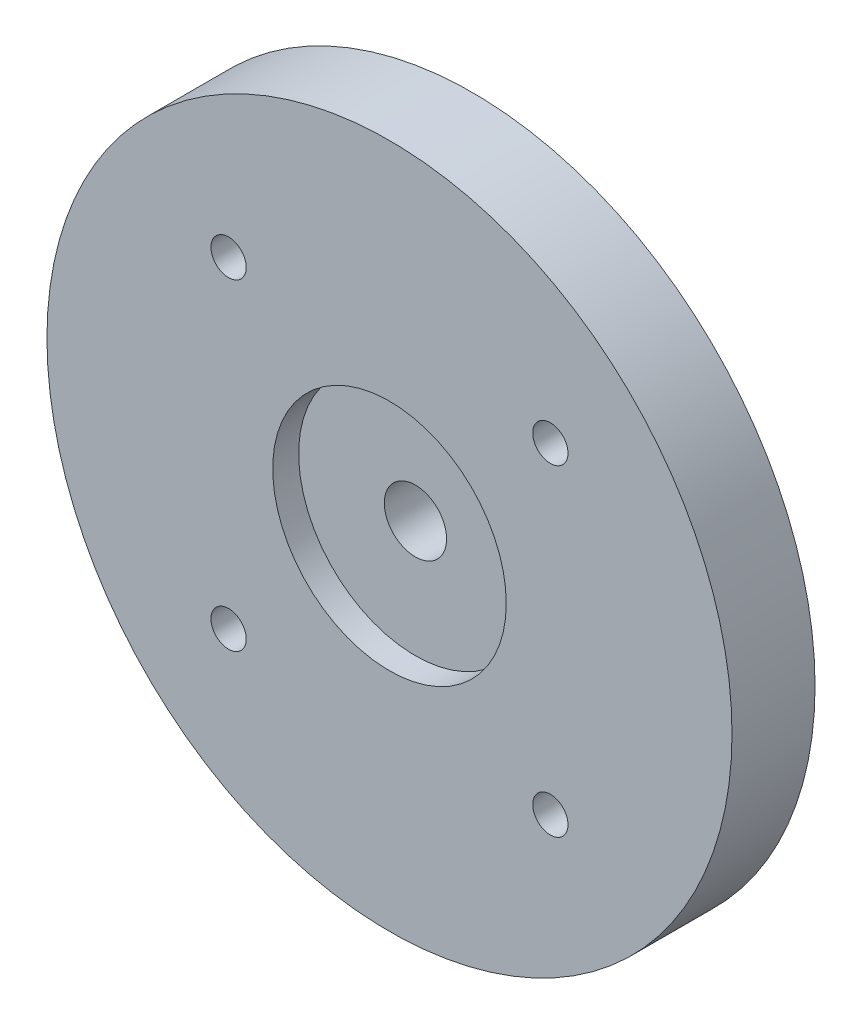
ISO-10303-21;
HEADER;
FILE_DESCRIPTION(('STEP AP214'),'2;1');
FILE_NAME('part.step','',(''),(''),'','','');
FILE_SCHEMA(('AUTOMOTIVE_DESIGN { 1 0 10303 214 1 1 1 1 }'));
ENDSEC;
DATA;
#1=APPLICATION_CONTEXT('core data for automotive mechanical design processes');
#2=APPLICATION_PROTOCOL_DEFINITION('international standard','automotive_design',2000,#1);
#3=PRODUCT_CONTEXT('',#1,'mechanical');
#4=PRODUCT('Part','Part','',(#3));
#5=PRODUCT_RELATED_PRODUCT_CATEGORY('part','',(#4));
#6=PRODUCT_DEFINITION_FORMATION('','',#4);
#7=PRODUCT_DEFINITION_CONTEXT('part definition',#1,'design');
#8=PRODUCT_DEFINITION('design','',#6,#7);
#9=PRODUCT_DEFINITION_SHAPE('','',#8);
#10=(LENGTH_UNIT() NAMED_UNIT(*) SI_UNIT(.MILLI.,.METRE.));
#11=(NAMED_UNIT(*) PLANE_ANGLE_UNIT() SI_UNIT($,.RADIAN.));
#12=(NAMED_UNIT(*) SI_UNIT($,.STERADIAN.) SOLID_ANGLE_UNIT());
#13=UNCERTAINTY_MEASURE_WITH_UNIT(LENGTH_MEASURE(1.E-05),#10,'distance_accuracy_value','');
#14=(GEOMETRIC_REPRESENTATION_CONTEXT(3) GLOBAL_UNCERTAINTY_ASSIGNED_CONTEXT((#13)) GLOBAL_UNIT_ASSIGNED_CONTEXT((#10,
#11,#12)) REPRESENTATION_CONTEXT('',''));
#15=CARTESIAN_POINT('',(0.,0.,0.));
#16=DIRECTION('',(0.,0.,1.));
#17=DIRECTION('',(1.,0.,0.));
#18=AXIS2_PLACEMENT_3D('',#15,#16,#17);
#19=CARTESIAN_POINT('',(0.,0.,-2.));
#20=DIRECTION('',(0.,0.,1.));
#21=DIRECTION('',(1.,0.,0.));
#22=AXIS2_PLACEMENT_3D('',#19,#20,#21);
#23=CYLINDRICAL_SURFACE('',#22,3.);
#24=CARTESIAN_POINT('',(0.,0.,-2.));
#25=DIRECTION('',(0.,0.,1.));
#26=DIRECTION('',(1.,0.,0.));
#27=AXIS2_PLACEMENT_3D('',#24,#25,#26);
#28=CIRCLE('',#27,3.);
#29=CARTESIAN_POINT('',(3.,0.,-2.));
#30=VERTEX_POINT('',#29);
#31=EDGE_CURVE('E64',#30,#30,#28,.T.);
#32=ORIENTED_EDGE('',*,*,#31,.F.);
#33=EDGE_LOOP('',(#32));
#34=FACE_BOUND('',#33,.T.);
#35=CARTESIAN_POINT('',(0.,0.,5.5));
#36=DIRECTION('',(0.,0.,1.));
#37=DIRECTION('',(1.,0.,0.));
#38=AXIS2_PLACEMENT_3D('',#35,#36,#37);
#39=CIRCLE('',#38,3.);
#40=CARTESIAN_POINT('',(3.,0.,5.5));
#41=VERTEX_POINT('',#40);
#42=EDGE_CURVE('E47',#41,#41,#39,.F.);
#43=ORIENTED_EDGE('',*,*,#42,.F.);
#44=EDGE_LOOP('',(#43));
#45=FACE_BOUND('',#44,.T.);
#46=ADVANCED_FACE('F43',(#34,#45),#23,.F.);
#47=CARTESIAN_POINT('',(-15.5,15.5,-2.));
#48=DIRECTION('',(0.,0.,1.));
#49=DIRECTION('',(1.,0.,0.));
#50=AXIS2_PLACEMENT_3D('',#47,#48,#49);
#51=CYLINDRICAL_SURFACE('',#50,1.7);
#52=CARTESIAN_POINT('',(-15.5,15.5,8.));
#53=DIRECTION('',(0.,0.,1.));
#54=DIRECTION('',(1.,0.,0.));
#55=AXIS2_PLACEMENT_3D('',#52,#53,#54);
#56=CIRCLE('',#55,1.7);
#57=CARTESIAN_POINT('',(-13.8,15.5,8.));
#58=VERTEX_POINT('',#57);
#59=EDGE_CURVE('E117',#58,#58,#56,.T.);
#60=ORIENTED_EDGE('',*,*,#59,.T.);
#61=EDGE_LOOP('',(#60));
#62=FACE_BOUND('',#61,.T.);
#63=CARTESIAN_POINT('',(-15.5,15.5,2.));
#64=DIRECTION('',(0.,0.,-1.));
#65=DIRECTION('',(-1.,0.,0.));
#66=AXIS2_PLACEMENT_3D('',#63,#64,#65);
#67=CIRCLE('',#66,1.7);
#68=CARTESIAN_POINT('',(-17.2,15.5,2.));
#69=VERTEX_POINT('',#68);
#70=EDGE_CURVE('E77',#69,#69,#67,.F.);
#71=ORIENTED_EDGE('',*,*,#70,.F.);
#72=EDGE_LOOP('',(#71));
#73=FACE_BOUND('',#72,.T.);
#74=ADVANCED_FACE('F187',(#62,#73),#51,.F.);
#75=CARTESIAN_POINT('',(15.5,15.5,-2.));
#76=DIRECTION('',(0.,0.,1.));
#77=DIRECTION('',(1.,0.,0.));
#78=AXIS2_PLACEMENT_3D('',#75,#76,#77);
#79=CYLINDRICAL_SURFACE('',#78,1.7);
#80=CARTESIAN_POINT('',(15.5,15.5,8.));
#81=DIRECTION('',(0.,0.,1.));
#82=DIRECTION('',(1.,0.,0.));
#83=AXIS2_PLACEMENT_3D('',#80,#81,#82);
#84=CIRCLE('',#83,1.7);
#85=CARTESIAN_POINT('',(17.2,15.5,8.));
#86=VERTEX_POINT('',#85);
#87=EDGE_CURVE('E113',#86,#86,#84,.T.);
#88=ORIENTED_EDGE('',*,*,#87,.T.);
#89=EDGE_LOOP('',(#88));
#90=FACE_BOUND('',#89,.T.);
#91=CARTESIAN_POINT('',(15.5,15.5,2.));
#92=DIRECTION('',(0.,0.,-1.));
#93=DIRECTION('',(-1.,0.,0.));
#94=AXIS2_PLACEMENT_3D('',#91,#92,#93);
#95=CIRCLE('',#94,1.7);
#96=CARTESIAN_POINT('',(13.8,15.5,2.));
#97=VERTEX_POINT('',#96);
#98=EDGE_CURVE('E81',#97,#97,#95,.F.);
#99=ORIENTED_EDGE('',*,*,#98,.F.);
#100=EDGE_LOOP('',(#99));
#101=FACE_BOUND('',#100,.T.);
#102=ADVANCED_FACE('F195',(#90,#101),#79,.F.);
#103=CARTESIAN_POINT('',(15.5,-15.5,-2.));
#104=DIRECTION('',(0.,0.,1.));
#105=DIRECTION('',(1.,0.,0.));
#106=AXIS2_PLACEMENT_3D('',#103,#104,#105);
#107=CYLINDRICAL_SURFACE('',#106,1.7);
#108=CARTESIAN_POINT('',(15.5,-15.5,8.));
#109=DIRECTION('',(0.,0.,1.));
#110=DIRECTION('',(1.,0.,0.));
#111=AXIS2_PLACEMENT_3D('',#108,#109,#110);
#112=CIRCLE('',#111,1.7);
#113=CARTESIAN_POINT('',(17.2,-15.5,8.));
#114=VERTEX_POINT('',#113);
#115=EDGE_CURVE('E109',#114,#114,#112,.T.);
#116=ORIENTED_EDGE('',*,*,#115,.T.);
#117=EDGE_LOOP('',(#116));
#118=FACE_BOUND('',#117,.T.);
#119=CARTESIAN_POINT('',(15.5,-15.5,2.));
#120=DIRECTION('',(0.,0.,-1.));
#121=DIRECTION('',(-1.,0.,0.));
#122=AXIS2_PLACEMENT_3D('',#119,#120,#121);
#123=CIRCLE('',#122,1.7);
#124=CARTESIAN_POINT('',(13.8,-15.5,2.));
#125=VERTEX_POINT('',#124);
#126=EDGE_CURVE('E85',#125,#125,#123,.F.);
#127=ORIENTED_EDGE('',*,*,#126,.F.);
#128=EDGE_LOOP('',(#127));
#129=FACE_BOUND('',#128,.T.);
#130=ADVANCED_FACE('F223',(#118,#129),#107,.F.);
#131=CARTESIAN_POINT('',(-15.5,-15.5,-2.));
#132=DIRECTION('',(0.,0.,1.));
#133=DIRECTION('',(1.,0.,0.));
#134=AXIS2_PLACEMENT_3D('',#131,#132,#133);
#135=CYLINDRICAL_SURFACE('',#134,1.7);
#136=CARTESIAN_POINT('',(-15.5,-15.5,8.));
#137=DIRECTION('',(0.,0.,1.));
#138=DIRECTION('',(1.,0.,0.));
#139=AXIS2_PLACEMENT_3D('',#136,#137,#138);
#140=CIRCLE('',#139,1.7);
#141=CARTESIAN_POINT('',(-13.8,-15.5,8.));
#142=VERTEX_POINT('',#141);
#143=EDGE_CURVE('E105',#142,#142,#140,.T.);
#144=ORIENTED_EDGE('',*,*,#143,.T.);
#145=EDGE_LOOP('',(#144));
#146=FACE_BOUND('',#145,.T.);
#147=CARTESIAN_POINT('',(-15.5,-15.5,2.));
#148=DIRECTION('',(0.,0.,-1.));
#149=DIRECTION('',(-1.,0.,0.));
#150=AXIS2_PLACEMENT_3D('',#147,#148,#149);
#151=CIRCLE('',#150,1.7);
#152=CARTESIAN_POINT('',(-17.2,-15.5,2.));
#153=VERTEX_POINT('',#152);
#154=EDGE_CURVE('E89',#153,#153,#151,.F.);
#155=ORIENTED_EDGE('',*,*,#154,.F.);
#156=EDGE_LOOP('',(#155));
#157=FACE_BOUND('',#156,.T.);
#158=ADVANCED_FACE('F200',(#146,#157),#135,.F.);
#159=CARTESIAN_POINT('',(0.,0.,8.));
#160=DIRECTION('',(0.,0.,-1.));
#161=DIRECTION('',(-1.,0.,0.));
#162=AXIS2_PLACEMENT_3D('',#159,#160,#161);
#163=CYLINDRICAL_SURFACE('',#162,33.);
#164=CARTESIAN_POINT('',(0.,0.,8.));
#165=DIRECTION('',(0.,0.,1.));
#166=DIRECTION('',(1.,0.,0.));
#167=AXIS2_PLACEMENT_3D('',#164,#165,#166);
#168=CIRCLE('',#167,33.);
#169=CARTESIAN_POINT('',(33.,0.,8.));
#170=VERTEX_POINT('',#169);
#171=EDGE_CURVE('E57',#170,#170,#168,.T.);
#172=ORIENTED_EDGE('',*,*,#171,.F.);
#173=EDGE_LOOP('',(#172));
#174=FACE_BOUND('',#173,.T.);
#175=CARTESIAN_POINT('',(0.,0.,0.));
#176=DIRECTION('',(0.,0.,1.));
#177=DIRECTION('',(1.,0.,0.));
#178=AXIS2_PLACEMENT_3D('',#175,#176,#177);
#179=CIRCLE('',#178,33.);
#180=CARTESIAN_POINT('',(33.,0.,0.));
#181=VERTEX_POINT('',#180);
#182=EDGE_CURVE('E94',#181,#181,#179,.T.);
#183=ORIENTED_EDGE('',*,*,#182,.T.);
#184=EDGE_LOOP('',(#183));
#185=FACE_BOUND('',#184,.T.);
#186=ADVANCED_FACE('F215',(#174,#185),#163,.T.);
#187=CARTESIAN_POINT('',(0.,0.,8.));
#188=DIRECTION('',(0.,0.,1.));
#189=DIRECTION('',(1.,0.,0.));
#190=AXIS2_PLACEMENT_3D('',#187,#188,#189);
#191=PLANE('',#190);
#192=CARTESIAN_POINT('',(0.,0.,8.));
#193=DIRECTION('',(0.,0.,1.));
#194=DIRECTION('',(1.,0.,0.));
#195=AXIS2_PLACEMENT_3D('',#192,#193,#194);
#196=CIRCLE('',#195,11.25);
#197=CARTESIAN_POINT('',(11.25,0.,8.));
#198=VERTEX_POINT('',#197);
#199=EDGE_CURVE('E171',#198,#198,#196,.T.);
#200=ORIENTED_EDGE('',*,*,#199,.F.);
#201=EDGE_LOOP('',(#200));
#202=FACE_BOUND('',#201,.T.);
#203=ORIENTED_EDGE('',*,*,#143,.F.);
#204=EDGE_LOOP('',(#203));
#205=FACE_BOUND('',#204,.T.);
#206=ORIENTED_EDGE('',*,*,#115,.F.);
#207=EDGE_LOOP('',(#206));
#208=FACE_BOUND('',#207,.T.);
#209=ORIENTED_EDGE('',*,*,#87,.F.);
#210=EDGE_LOOP('',(#209));
#211=FACE_BOUND('',#210,.T.);
#212=ORIENTED_EDGE('',*,*,#59,.F.);
#213=EDGE_LOOP('',(#212));
#214=FACE_BOUND('',#213,.T.);
#215=ORIENTED_EDGE('',*,*,#171,.T.);
#216=EDGE_LOOP('',(#215));
#217=FACE_BOUND('',#216,.T.);
#218=ADVANCED_FACE('F213',(#202,#205,#208,#211,#214,#217),#191,.T.);
#219=CARTESIAN_POINT('',(0.,0.,0.));
#220=DIRECTION('',(0.,0.,1.));
#221=DIRECTION('',(1.,0.,0.));
#222=AXIS2_PLACEMENT_3D('',#219,#220,#221);
#223=PLANE('',#222);
#224=CARTESIAN_POINT('',(0.,0.,0.));
#225=DIRECTION('',(0.,0.,1.));
#226=DIRECTION('',(1.,0.,0.));
#227=AXIS2_PLACEMENT_3D('',#224,#225,#226);
#228=CIRCLE('',#227,11.);
#229=CARTESIAN_POINT('',(11.,0.,0.));
#230=VERTEX_POINT('',#229);
#231=EDGE_CURVE('E10',#230,#230,#228,.T.);
#232=ORIENTED_EDGE('',*,*,#231,.T.);
#233=EDGE_LOOP('',(#232));
#234=FACE_BOUND('',#233,.T.);
#235=CARTESIAN_POINT('',(0.,29.5,0.));
#236=DIRECTION('',(0.,0.,-1.));
#237=DIRECTION('',(-1.,0.,0.));
#238=AXIS2_PLACEMENT_3D('',#235,#236,#237);
#239=CIRCLE('',#238,2.1);
#240=CARTESIAN_POINT('',(-2.1,29.5,0.));
#241=VERTEX_POINT('',#240);
#242=EDGE_CURVE('E164',#241,#241,#239,.T.);
#243=ORIENTED_EDGE('',*,*,#242,.F.);
#244=EDGE_LOOP('',(#243));
#245=FACE_BOUND('',#244,.T.);
#246=CARTESIAN_POINT('',(-29.5,-5.65519853168439E-13,0.));
#247=DIRECTION('',(0.,0.,-1.));
#248=DIRECTION('',(-1.,0.,0.));
#249=AXIS2_PLACEMENT_3D('',#246,#247,#248);
#250=CIRCLE('',#249,2.1);
#251=CARTESIAN_POINT('',(-31.6,-5.65519853168439E-13,0.));
#252=VERTEX_POINT('',#251);
#253=EDGE_CURVE('E160',#252,#252,#250,.T.);
#254=ORIENTED_EDGE('',*,*,#253,.F.);
#255=EDGE_LOOP('',(#254));
#256=FACE_BOUND('',#255,.T.);
#257=CARTESIAN_POINT('',(6.96595987118696E-13,-29.5,0.));
#258=DIRECTION('',(0.,0.,-1.));
#259=DIRECTION('',(-1.,0.,0.));
#260=AXIS2_PLACEMENT_3D('',#257,#258,#259);
#261=CIRCLE('',#260,2.1);
#262=CARTESIAN_POINT('',(-2.0999999999993,-29.5,0.));
#263=VERTEX_POINT('',#262);
#264=EDGE_CURVE('E152',#263,#263,#261,.T.);
#265=ORIENTED_EDGE('',*,*,#264,.F.);
#266=EDGE_LOOP('',(#265));
#267=FACE_BOUND('',#266,.T.);
#268=CARTESIAN_POINT('',(29.5000000000006,0.,0.));
#269=DIRECTION('',(0.,0.,-1.));
#270=DIRECTION('',(-1.,0.,0.));
#271=AXIS2_PLACEMENT_3D('',#268,#269,#270);
#272=CIRCLE('',#271,2.10000000000062);
#273=CARTESIAN_POINT('',(27.3999999999999,0.,0.));
#274=VERTEX_POINT('',#273);
#275=EDGE_CURVE('E144',#274,#274,#272,.T.);
#276=ORIENTED_EDGE('',*,*,#275,.F.);
#277=EDGE_LOOP('',(#276));
#278=FACE_BOUND('',#277,.T.);
#279=CARTESIAN_POINT('',(15.5,-15.5,0.));
#280=DIRECTION('',(0.,0.,1.));
#281=DIRECTION('',(1.,0.,0.));
#282=AXIS2_PLACEMENT_3D('',#279,#280,#281);
#283=CIRCLE('',#282,2.8);
#284=CARTESIAN_POINT('',(18.3,-15.5,0.));
#285=VERTEX_POINT('',#284);
#286=EDGE_CURVE('E60',#285,#285,#283,.F.);
#287=ORIENTED_EDGE('',*,*,#286,.F.);
#288=EDGE_LOOP('',(#287));
#289=FACE_BOUND('',#288,.T.);
#290=CARTESIAN_POINT('',(-15.5,-15.5,0.));
#291=DIRECTION('',(0.,0.,1.));
#292=DIRECTION('',(1.,0.,0.));
#293=AXIS2_PLACEMENT_3D('',#290,#291,#292);
#294=CIRCLE('',#293,2.8);
#295=CARTESIAN_POINT('',(-12.7,-15.5,0.));
#296=VERTEX_POINT('',#295);
#297=EDGE_CURVE('E65',#296,#296,#294,.F.);
#298=ORIENTED_EDGE('',*,*,#297,.F.);
#299=EDGE_LOOP('',(#298));
#300=FACE_BOUND('',#299,.T.);
#301=CARTESIAN_POINT('',(-15.5,15.5,0.));
#302=DIRECTION('',(0.,0.,1.));
#303=DIRECTION('',(1.,0.,0.));
#304=AXIS2_PLACEMENT_3D('',#301,#302,#303);
#305=CIRCLE('',#304,2.8);
#306=CARTESIAN_POINT('',(-12.7,15.5,0.));
#307=VERTEX_POINT('',#306);
#308=EDGE_CURVE('E69',#307,#307,#305,.F.);
#309=ORIENTED_EDGE('',*,*,#308,.F.);
#310=EDGE_LOOP('',(#309));
#311=FACE_BOUND('',#310,.T.);
#312=CARTESIAN_POINT('',(15.5,15.5,0.));
#313=DIRECTION('',(0.,0.,1.));
#314=DIRECTION('',(1.,0.,0.));
#315=AXIS2_PLACEMENT_3D('',#312,#313,#314);
#316=CIRCLE('',#315,2.8);
#317=CARTESIAN_POINT('',(18.3,15.5,0.));
#318=VERTEX_POINT('',#317);
#319=EDGE_CURVE('E73',#318,#318,#316,.F.);
#320=ORIENTED_EDGE('',*,*,#319,.F.);
#321=EDGE_LOOP('',(#320));
#322=FACE_BOUND('',#321,.T.);
#323=ORIENTED_EDGE('',*,*,#182,.F.);
#324=EDGE_LOOP('',(#323));
#325=FACE_BOUND('',#324,.T.);
#326=ADVANCED_FACE('F211',(#234,#245,#256,#267,#278,#289,#300,#311,#322,#325),#223,.F.);
#327=CARTESIAN_POINT('',(0.,0.,-2.));
#328=DIRECTION('',(0.,0.,1.));
#329=DIRECTION('',(1.,0.,0.));
#330=AXIS2_PLACEMENT_3D('',#327,#328,#329);
#331=CYLINDRICAL_SURFACE('',#330,10.);
#332=CARTESIAN_POINT('',(0.,0.,-1.));
#333=DIRECTION('',(0.,0.,1.));
#334=DIRECTION('',(1.,0.,0.));
#335=AXIS2_PLACEMENT_3D('',#332,#333,#334);
#336=CIRCLE('',#335,10.);
#337=CARTESIAN_POINT('',(10.,0.,-1.));
#338=VERTEX_POINT('',#337);
#339=EDGE_CURVE('E52',#338,#338,#336,.F.);
#340=ORIENTED_EDGE('',*,*,#339,.T.);
#341=EDGE_LOOP('',(#340));
#342=FACE_BOUND('',#341,.T.);
#343=CARTESIAN_POINT('',(0.,0.,-2.));
#344=DIRECTION('',(0.,0.,-1.));
#345=DIRECTION('',(-1.,0.,0.));
#346=AXIS2_PLACEMENT_3D('',#343,#344,#345);
#347=CIRCLE('',#346,10.);
#348=CARTESIAN_POINT('',(-10.,0.,-2.));
#349=VERTEX_POINT('',#348);
#350=EDGE_CURVE('E98',#349,#349,#347,.T.);
#351=ORIENTED_EDGE('',*,*,#350,.F.);
#352=EDGE_LOOP('',(#351));
#353=FACE_BOUND('',#352,.T.);
#354=ADVANCED_FACE('F207',(#342,#353),#331,.T.);
#355=CARTESIAN_POINT('',(0.,0.,-2.));
#356=DIRECTION('',(0.,0.,-1.));
#357=DIRECTION('',(-1.,0.,0.));
#358=AXIS2_PLACEMENT_3D('',#355,#356,#357);
#359=PLANE('',#358);
#360=ORIENTED_EDGE('',*,*,#31,.T.);
#361=EDGE_LOOP('',(#360));
#362=FACE_BOUND('',#361,.T.);
#363=ORIENTED_EDGE('',*,*,#350,.T.);
#364=EDGE_LOOP('',(#363));
#365=FACE_BOUND('',#364,.T.);
#366=ADVANCED_FACE('F203',(#362,#365),#359,.T.);
#367=CARTESIAN_POINT('',(-15.5,-15.5,-2.));
#368=DIRECTION('',(0.,0.,1.));
#369=DIRECTION('',(1.,0.,0.));
#370=AXIS2_PLACEMENT_3D('',#367,#368,#369);
#371=CYLINDRICAL_SURFACE('',#370,2.8);
#372=CARTESIAN_POINT('',(-15.5,-15.5,2.));
#373=DIRECTION('',(0.,0.,-1.));
#374=DIRECTION('',(-1.,0.,0.));
#375=AXIS2_PLACEMENT_3D('',#372,#373,#374);
#376=CIRCLE('',#375,2.8);
#377=CARTESIAN_POINT('',(-18.3,-15.5,2.));
#378=VERTEX_POINT('',#377);
#379=EDGE_CURVE('E132',#378,#378,#376,.T.);
#380=ORIENTED_EDGE('',*,*,#379,.F.);
#381=EDGE_LOOP('',(#380));
#382=FACE_BOUND('',#381,.T.);
#383=ORIENTED_EDGE('',*,*,#297,.T.);
#384=EDGE_LOOP('',(#383));
#385=FACE_BOUND('',#384,.T.);
#386=ADVANCED_FACE('F206',(#382,#385),#371,.F.);
#387=CARTESIAN_POINT('',(-15.5,-15.5,2.));
#388=DIRECTION('',(0.,0.,-1.));
#389=DIRECTION('',(-1.,0.,0.));
#390=AXIS2_PLACEMENT_3D('',#387,#388,#389);
#391=PLANE('',#390);
#392=ORIENTED_EDGE('',*,*,#379,.T.);
#393=EDGE_LOOP('',(#392));
#394=FACE_BOUND('',#393,.T.);
#395=ORIENTED_EDGE('',*,*,#154,.T.);
#396=EDGE_LOOP('',(#395));
#397=FACE_BOUND('',#396,.T.);
#398=ADVANCED_FACE('F239',(#394,#397),#391,.T.);
#399=CARTESIAN_POINT('',(15.5,-15.5,-2.));
#400=DIRECTION('',(0.,0.,1.));
#401=DIRECTION('',(1.,0.,0.));
#402=AXIS2_PLACEMENT_3D('',#399,#400,#401);
#403=CYLINDRICAL_SURFACE('',#402,2.8);
#404=CARTESIAN_POINT('',(15.5,-15.5,2.));
#405=DIRECTION('',(0.,0.,-1.));
#406=DIRECTION('',(-1.,0.,0.));
#407=AXIS2_PLACEMENT_3D('',#404,#405,#406);
#408=CIRCLE('',#407,2.8);
#409=CARTESIAN_POINT('',(12.7,-15.5,2.));
#410=VERTEX_POINT('',#409);
#411=EDGE_CURVE('E128',#410,#410,#408,.T.);
#412=ORIENTED_EDGE('',*,*,#411,.F.);
#413=EDGE_LOOP('',(#412));
#414=FACE_BOUND('',#413,.T.);
#415=ORIENTED_EDGE('',*,*,#286,.T.);
#416=EDGE_LOOP('',(#415));
#417=FACE_BOUND('',#416,.T.);
#418=ADVANCED_FACE('F241',(#414,#417),#403,.F.);
#419=CARTESIAN_POINT('',(15.5,-15.5,2.));
#420=DIRECTION('',(0.,0.,-1.));
#421=DIRECTION('',(-1.,0.,0.));
#422=AXIS2_PLACEMENT_3D('',#419,#420,#421);
#423=PLANE('',#422);
#424=ORIENTED_EDGE('',*,*,#411,.T.);
#425=EDGE_LOOP('',(#424));
#426=FACE_BOUND('',#425,.T.);
#427=ORIENTED_EDGE('',*,*,#126,.T.);
#428=EDGE_LOOP('',(#427));
#429=FACE_BOUND('',#428,.T.);
#430=ADVANCED_FACE('F247',(#426,#429),#423,.T.);
#431=CARTESIAN_POINT('',(15.5,15.5,-2.));
#432=DIRECTION('',(0.,0.,1.));
#433=DIRECTION('',(1.,0.,0.));
#434=AXIS2_PLACEMENT_3D('',#431,#432,#433);
#435=CYLINDRICAL_SURFACE('',#434,2.8);
#436=CARTESIAN_POINT('',(15.5,15.5,2.));
#437=DIRECTION('',(0.,0.,-1.));
#438=DIRECTION('',(-1.,0.,0.));
#439=AXIS2_PLACEMENT_3D('',#436,#437,#438);
#440=CIRCLE('',#439,2.8);
#441=CARTESIAN_POINT('',(12.7,15.5,2.));
#442=VERTEX_POINT('',#441);
#443=EDGE_CURVE('E93',#442,#442,#440,.T.);
#444=ORIENTED_EDGE('',*,*,#443,.F.);
#445=EDGE_LOOP('',(#444));
#446=FACE_BOUND('',#445,.T.);
#447=ORIENTED_EDGE('',*,*,#319,.T.);
#448=EDGE_LOOP('',(#447));
#449=FACE_BOUND('',#448,.T.);
#450=ADVANCED_FACE('F256',(#446,#449),#435,.F.);
#451=CARTESIAN_POINT('',(15.5,15.5,2.));
#452=DIRECTION('',(0.,0.,-1.));
#453=DIRECTION('',(-1.,0.,0.));
#454=AXIS2_PLACEMENT_3D('',#451,#452,#453);
#455=PLANE('',#454);
#456=ORIENTED_EDGE('',*,*,#443,.T.);
#457=EDGE_LOOP('',(#456));
#458=FACE_BOUND('',#457,.T.);
#459=ORIENTED_EDGE('',*,*,#98,.T.);
#460=EDGE_LOOP('',(#459));
#461=FACE_BOUND('',#460,.T.);
#462=ADVANCED_FACE('F258',(#458,#461),#455,.T.);
#463=CARTESIAN_POINT('',(-15.5,15.5,-2.));
#464=DIRECTION('',(0.,0.,1.));
#465=DIRECTION('',(1.,0.,0.));
#466=AXIS2_PLACEMENT_3D('',#463,#464,#465);
#467=CYLINDRICAL_SURFACE('',#466,2.8);
#468=CARTESIAN_POINT('',(-15.5,15.5,2.));
#469=DIRECTION('',(0.,0.,-1.));
#470=DIRECTION('',(-1.,0.,0.));
#471=AXIS2_PLACEMENT_3D('',#468,#469,#470);
#472=CIRCLE('',#471,2.8);
#473=CARTESIAN_POINT('',(-18.3,15.5,2.));
#474=VERTEX_POINT('',#473);
#475=EDGE_CURVE('E127',#474,#474,#472,.T.);
#476=ORIENTED_EDGE('',*,*,#475,.F.);
#477=EDGE_LOOP('',(#476));
#478=FACE_BOUND('',#477,.T.);
#479=ORIENTED_EDGE('',*,*,#308,.T.);
#480=EDGE_LOOP('',(#479));
#481=FACE_BOUND('',#480,.T.);
#482=ADVANCED_FACE('F261',(#478,#481),#467,.F.);
#483=CARTESIAN_POINT('',(-15.5,15.5,2.));
#484=DIRECTION('',(0.,0.,-1.));
#485=DIRECTION('',(-1.,0.,0.));
#486=AXIS2_PLACEMENT_3D('',#483,#484,#485);
#487=PLANE('',#486);
#488=ORIENTED_EDGE('',*,*,#475,.T.);
#489=EDGE_LOOP('',(#488));
#490=FACE_BOUND('',#489,.T.);
#491=ORIENTED_EDGE('',*,*,#70,.T.);
#492=EDGE_LOOP('',(#491));
#493=FACE_BOUND('',#492,.T.);
#494=ADVANCED_FACE('F280',(#490,#493),#487,.T.);
#495=CARTESIAN_POINT('',(29.5000000000006,0.,6.));
#496=DIRECTION('',(0.,0.,-1.));
#497=DIRECTION('',(-1.,0.,0.));
#498=AXIS2_PLACEMENT_3D('',#495,#496,#497);
#499=CYLINDRICAL_SURFACE('',#498,2.10000000000062);
#500=CARTESIAN_POINT('',(29.5000000000006,0.,6.));
#501=DIRECTION('',(0.,0.,-1.));
#502=DIRECTION('',(-1.,0.,0.));
#503=AXIS2_PLACEMENT_3D('',#500,#501,#502);
#504=CIRCLE('',#503,2.10000000000062);
#505=CARTESIAN_POINT('',(27.3999999999999,0.,6.));
#506=VERTEX_POINT('',#505);
#507=EDGE_CURVE('E140',#506,#506,#504,.T.);
#508=ORIENTED_EDGE('',*,*,#507,.F.);
#509=EDGE_LOOP('',(#508));
#510=FACE_BOUND('',#509,.T.);
#511=ORIENTED_EDGE('',*,*,#275,.T.);
#512=EDGE_LOOP('',(#511));
#513=FACE_BOUND('',#512,.T.);
#514=ADVANCED_FACE('F282',(#510,#513),#499,.F.);
#515=CARTESIAN_POINT('',(29.5000000000006,0.,6.));
#516=DIRECTION('',(0.,0.,-1.));
#517=DIRECTION('',(-1.,0.,0.));
#518=AXIS2_PLACEMENT_3D('',#515,#516,#517);
#519=PLANE('',#518);
#520=ORIENTED_EDGE('',*,*,#507,.T.);
#521=EDGE_LOOP('',(#520));
#522=FACE_BOUND('',#521,.T.);
#523=ADVANCED_FACE('F288',(#522),#519,.T.);
#524=CARTESIAN_POINT('',(6.96595987118696E-13,-29.5,6.));
#525=DIRECTION('',(0.,0.,-1.));
#526=DIRECTION('',(-1.,0.,0.));
#527=AXIS2_PLACEMENT_3D('',#524,#525,#526);
#528=CYLINDRICAL_SURFACE('',#527,2.1);
#529=CARTESIAN_POINT('',(6.96595987118696E-13,-29.5,6.));
#530=DIRECTION('',(0.,0.,-1.));
#531=DIRECTION('',(-1.,0.,0.));
#532=AXIS2_PLACEMENT_3D('',#529,#530,#531);
#533=CIRCLE('',#532,2.1);
#534=CARTESIAN_POINT('',(-2.0999999999993,-29.5,6.));
#535=VERTEX_POINT('',#534);
#536=EDGE_CURVE('E148',#535,#535,#533,.T.);
#537=ORIENTED_EDGE('',*,*,#536,.F.);
#538=EDGE_LOOP('',(#537));
#539=FACE_BOUND('',#538,.T.);
#540=ORIENTED_EDGE('',*,*,#264,.T.);
#541=EDGE_LOOP('',(#540));
#542=FACE_BOUND('',#541,.T.);
#543=ADVANCED_FACE('F295',(#539,#542),#528,.F.);
#544=CARTESIAN_POINT('',(6.96595987118696E-13,-29.5,6.));
#545=DIRECTION('',(0.,0.,-1.));
#546=DIRECTION('',(-1.,0.,0.));
#547=AXIS2_PLACEMENT_3D('',#544,#545,#546);
#548=PLANE('',#547);
#549=ORIENTED_EDGE('',*,*,#536,.T.);
#550=EDGE_LOOP('',(#549));
#551=FACE_BOUND('',#550,.T.);
#552=ADVANCED_FACE('F298',(#551),#548,.T.);
#553=CARTESIAN_POINT('',(-29.5,-5.65519853168439E-13,6.));
#554=DIRECTION('',(0.,0.,-1.));
#555=DIRECTION('',(-1.,0.,0.));
#556=AXIS2_PLACEMENT_3D('',#553,#554,#555);
#557=CYLINDRICAL_SURFACE('',#556,2.1);
#558=CARTESIAN_POINT('',(-29.5,-5.65519853168439E-13,6.));
#559=DIRECTION('',(0.,0.,-1.));
#560=DIRECTION('',(-1.,0.,0.));
#561=AXIS2_PLACEMENT_3D('',#558,#559,#560);
#562=CIRCLE('',#561,2.1);
#563=CARTESIAN_POINT('',(-31.6,-5.65519853168439E-13,6.));
#564=VERTEX_POINT('',#563);
#565=EDGE_CURVE('E156',#564,#564,#562,.T.);
#566=ORIENTED_EDGE('',*,*,#565,.F.);
#567=EDGE_LOOP('',(#566));
#568=FACE_BOUND('',#567,.T.);
#569=ORIENTED_EDGE('',*,*,#253,.T.);
#570=EDGE_LOOP('',(#569));
#571=FACE_BOUND('',#570,.T.);
#572=ADVANCED_FACE('F301',(#568,#571),#557,.F.);
#573=CARTESIAN_POINT('',(-29.5,-5.65519853168439E-13,6.));
#574=DIRECTION('',(0.,0.,-1.));
#575=DIRECTION('',(-1.,0.,0.));
#576=AXIS2_PLACEMENT_3D('',#573,#574,#575);
#577=PLANE('',#576);
#578=ORIENTED_EDGE('',*,*,#565,.T.);
#579=EDGE_LOOP('',(#578));
#580=FACE_BOUND('',#579,.T.);
#581=ADVANCED_FACE('F306',(#580),#577,.T.);
#582=CARTESIAN_POINT('',(0.,29.5,6.));
#583=DIRECTION('',(0.,0.,-1.));
#584=DIRECTION('',(-1.,0.,0.));
#585=AXIS2_PLACEMENT_3D('',#582,#583,#584);
#586=CYLINDRICAL_SURFACE('',#585,2.1);
#587=CARTESIAN_POINT('',(0.,29.5,6.));
#588=DIRECTION('',(0.,0.,-1.));
#589=DIRECTION('',(-1.,0.,0.));
#590=AXIS2_PLACEMENT_3D('',#587,#588,#589);
#591=CIRCLE('',#590,2.1);
#592=CARTESIAN_POINT('',(-2.1,29.5,6.));
#593=VERTEX_POINT('',#592);
#594=EDGE_CURVE('E133',#593,#593,#591,.T.);
#595=ORIENTED_EDGE('',*,*,#594,.F.);
#596=EDGE_LOOP('',(#595));
#597=FACE_BOUND('',#596,.T.);
#598=ORIENTED_EDGE('',*,*,#242,.T.);
#599=EDGE_LOOP('',(#598));
#600=FACE_BOUND('',#599,.T.);
#601=ADVANCED_FACE('F309',(#597,#600),#586,.F.);
#602=CARTESIAN_POINT('',(0.,29.5,6.));
#603=DIRECTION('',(0.,0.,-1.));
#604=DIRECTION('',(-1.,0.,0.));
#605=AXIS2_PLACEMENT_3D('',#602,#603,#604);
#606=PLANE('',#605);
#607=ORIENTED_EDGE('',*,*,#594,.T.);
#608=EDGE_LOOP('',(#607));
#609=FACE_BOUND('',#608,.T.);
#610=ADVANCED_FACE('F316',(#609),#606,.T.);
#611=CARTESIAN_POINT('',(0.,0.,-1.));
#612=DIRECTION('',(0.,0.,1.));
#613=DIRECTION('',(1.,0.,0.));
#614=AXIS2_PLACEMENT_3D('',#611,#612,#613);
#615=TOROIDAL_SURFACE('',#614,11.,1.);
#616=ORIENTED_EDGE('',*,*,#231,.F.);
#617=EDGE_LOOP('',(#616));
#618=FACE_BOUND('',#617,.T.);
#619=ORIENTED_EDGE('',*,*,#339,.F.);
#620=EDGE_LOOP('',(#619));
#621=FACE_BOUND('',#620,.T.);
#622=ADVANCED_FACE('F45',(#618,#621),#615,.F.);
#623=CARTESIAN_POINT('',(0.,0.,5.5));
#624=DIRECTION('',(0.,0.,1.));
#625=DIRECTION('',(1.,0.,0.));
#626=AXIS2_PLACEMENT_3D('',#623,#624,#625);
#627=PLANE('',#626);
#628=CARTESIAN_POINT('',(0.,0.,5.5));
#629=DIRECTION('',(0.,0.,1.));
#630=DIRECTION('',(1.,0.,0.));
#631=AXIS2_PLACEMENT_3D('',#628,#629,#630);
#632=CIRCLE('',#631,11.25);
#633=CARTESIAN_POINT('',(11.25,0.,5.5));
#634=VERTEX_POINT('',#633);
#635=EDGE_CURVE('E175',#634,#634,#632,.T.);
#636=ORIENTED_EDGE('',*,*,#635,.T.);
#637=EDGE_LOOP('',(#636));
#638=FACE_BOUND('',#637,.T.);
#639=ORIENTED_EDGE('',*,*,#42,.T.);
#640=EDGE_LOOP('',(#639));
#641=FACE_BOUND('',#640,.T.);
#642=ADVANCED_FACE('F184',(#638,#641),#627,.T.);
#643=CARTESIAN_POINT('',(0.,0.,5.5));
#644=DIRECTION('',(0.,0.,1.));
#645=DIRECTION('',(1.,0.,0.));
#646=AXIS2_PLACEMENT_3D('',#643,#644,#645);
#647=CYLINDRICAL_SURFACE('',#646,11.25);
#648=ORIENTED_EDGE('',*,*,#635,.F.);
#649=EDGE_LOOP('',(#648));
#650=FACE_BOUND('',#649,.T.);
#651=ORIENTED_EDGE('',*,*,#199,.T.);
#652=EDGE_LOOP('',(#651));
#653=FACE_BOUND('',#652,.T.);
#654=ADVANCED_FACE('F321',(#650,#653),#647,.F.);
#655=CLOSED_SHELL('',(#46,#74,#102,#130,#158,#186,#218,#326,#354,#366,#386,#398,#418,#430,#450,
#462,#482,#494,#514,#523,#543,#552,#572,#581,#601,#610,#622,#642,#654));
#656=MANIFOLD_SOLID_BREP('B2',#655);
#657=ADVANCED_BREP_SHAPE_REPRESENTATION('',(#18,#656),#14);
#658=SHAPE_DEFINITION_REPRESENTATION(#9,#657);
ENDSEC;
END-ISO-10303-21;
